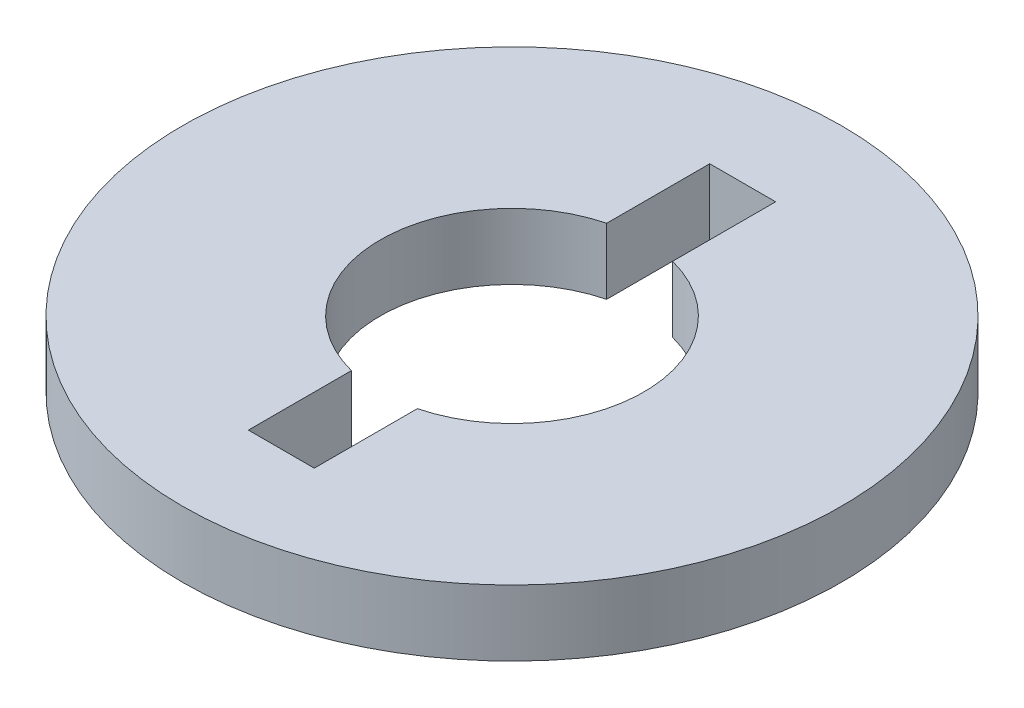
ISO-10303-21;
HEADER;
FILE_DESCRIPTION(('STEP AP214'),'2;1');
FILE_NAME('part.step','',(''),(''),'','','');
FILE_SCHEMA(('AUTOMOTIVE_DESIGN { 1 0 10303 214 1 1 1 1 }'));
ENDSEC;
DATA;
#1=APPLICATION_CONTEXT('core data for automotive mechanical design processes');
#2=APPLICATION_PROTOCOL_DEFINITION('international standard','automotive_design',2000,#1);
#3=PRODUCT_CONTEXT('',#1,'mechanical');
#4=PRODUCT('Part','Part','',(#3));
#5=PRODUCT_RELATED_PRODUCT_CATEGORY('part','',(#4));
#6=PRODUCT_DEFINITION_FORMATION('','',#4);
#7=PRODUCT_DEFINITION_CONTEXT('part definition',#1,'design');
#8=PRODUCT_DEFINITION('design','',#6,#7);
#9=PRODUCT_DEFINITION_SHAPE('','',#8);
#10=(LENGTH_UNIT() NAMED_UNIT(*) SI_UNIT(.MILLI.,.METRE.));
#11=(NAMED_UNIT(*) PLANE_ANGLE_UNIT() SI_UNIT($,.RADIAN.));
#12=(NAMED_UNIT(*) SI_UNIT($,.STERADIAN.) SOLID_ANGLE_UNIT());
#13=UNCERTAINTY_MEASURE_WITH_UNIT(LENGTH_MEASURE(1.E-05),#10,'distance_accuracy_value','');
#14=(GEOMETRIC_REPRESENTATION_CONTEXT(3) GLOBAL_UNCERTAINTY_ASSIGNED_CONTEXT((#13)) GLOBAL_UNIT_ASSIGNED_CONTEXT((#10,
#11,#12)) REPRESENTATION_CONTEXT('',''));
#15=CARTESIAN_POINT('',(0.,0.,0.));
#16=DIRECTION('',(0.,0.,1.));
#17=DIRECTION('',(1.,0.,0.));
#18=AXIS2_PLACEMENT_3D('',#15,#16,#17);
#19=CARTESIAN_POINT('',(0.,1.,0.));
#20=DIRECTION('',(0.,1.,0.));
#21=DIRECTION('',(0.,0.,1.));
#22=AXIS2_PLACEMENT_3D('',#19,#20,#21);
#23=PLANE('',#22);
#24=CARTESIAN_POINT('',(0.,1.,0.));
#25=DIRECTION('',(0.,1.,0.));
#26=DIRECTION('',(0.,0.,1.));
#27=AXIS2_PLACEMENT_3D('',#24,#25,#26);
#28=CIRCLE('',#27,5.);
#29=CARTESIAN_POINT('',(0.,1.,5.));
#30=VERTEX_POINT('',#29);
#31=EDGE_CURVE('E11',#30,#30,#28,.T.);
#32=ORIENTED_EDGE('',*,*,#31,.T.);
#33=EDGE_LOOP('',(#32));
#34=FACE_BOUND('',#33,.T.);
#35=DIRECTION('',(0.,0.,1.));
#36=VECTOR('',#35,1.);
#37=CARTESIAN_POINT('',(-0.5,1.,-1.93649167310371));
#38=LINE('',#37,#36);
#39=CARTESIAN_POINT('',(-0.5,1.,-3.5));
#40=VERTEX_POINT('',#39);
#41=CARTESIAN_POINT('',(-0.499999999999999,1.,-1.93649167310371));
#42=VERTEX_POINT('',#41);
#43=EDGE_CURVE('E114',#40,#42,#38,.T.);
#44=ORIENTED_EDGE('',*,*,#43,.F.);
#45=DIRECTION('',(-1.,0.,0.));
#46=VECTOR('',#45,1.);
#47=CARTESIAN_POINT('',(-0.5,1.,-3.5));
#48=LINE('',#47,#46);
#49=CARTESIAN_POINT('',(0.5,1.,-3.5));
#50=VERTEX_POINT('',#49);
#51=EDGE_CURVE('E106',#50,#40,#48,.T.);
#52=ORIENTED_EDGE('',*,*,#51,.F.);
#53=DIRECTION('',(0.,0.,-1.));
#54=VECTOR('',#53,1.);
#55=CARTESIAN_POINT('',(0.5,1.,-1.93649167310371));
#56=LINE('',#55,#54);
#57=CARTESIAN_POINT('',(0.5,1.,-1.93649167310371));
#58=VERTEX_POINT('',#57);
#59=EDGE_CURVE('E138',#58,#50,#56,.T.);
#60=ORIENTED_EDGE('',*,*,#59,.F.);
#61=CARTESIAN_POINT('',(0.,1.,0.));
#62=DIRECTION('',(0.,1.,0.));
#63=DIRECTION('',(0.,0.,1.));
#64=AXIS2_PLACEMENT_3D('',#61,#62,#63);
#65=CIRCLE('',#64,2.);
#66=CARTESIAN_POINT('',(0.5,1.,1.93649167310371));
#67=VERTEX_POINT('',#66);
#68=EDGE_CURVE('E136',#67,#58,#65,.T.);
#69=ORIENTED_EDGE('',*,*,#68,.F.);
#70=DIRECTION('',(0.,0.,-1.));
#71=VECTOR('',#70,1.);
#72=CARTESIAN_POINT('',(0.5,1.,3.5));
#73=LINE('',#72,#71);
#74=CARTESIAN_POINT('',(0.5,1.,3.5));
#75=VERTEX_POINT('',#74);
#76=EDGE_CURVE('E134',#75,#67,#73,.T.);
#77=ORIENTED_EDGE('',*,*,#76,.F.);
#78=DIRECTION('',(1.,0.,0.));
#79=VECTOR('',#78,1.);
#80=CARTESIAN_POINT('',(-0.5,1.,3.5));
#81=LINE('',#80,#79);
#82=CARTESIAN_POINT('',(-0.5,1.,3.5));
#83=VERTEX_POINT('',#82);
#84=EDGE_CURVE('E132',#83,#75,#81,.T.);
#85=ORIENTED_EDGE('',*,*,#84,.F.);
#86=DIRECTION('',(0.,0.,1.));
#87=VECTOR('',#86,1.);
#88=CARTESIAN_POINT('',(-0.5,1.,3.5));
#89=LINE('',#88,#87);
#90=CARTESIAN_POINT('',(-0.5,1.,1.93649167310371));
#91=VERTEX_POINT('',#90);
#92=EDGE_CURVE('E128',#91,#83,#89,.T.);
#93=ORIENTED_EDGE('',*,*,#92,.F.);
#94=CARTESIAN_POINT('',(0.,1.,0.));
#95=DIRECTION('',(0.,1.,0.));
#96=DIRECTION('',(0.,0.,1.));
#97=AXIS2_PLACEMENT_3D('',#94,#95,#96);
#98=CIRCLE('',#97,2.);
#99=EDGE_CURVE('E126',#42,#91,#98,.T.);
#100=ORIENTED_EDGE('',*,*,#99,.F.);
#101=EDGE_LOOP('',(#44,#52,#60,#69,#77,#85,#93,#100));
#102=FACE_BOUND('',#101,.T.);
#103=ADVANCED_FACE('F41',(#34,#102),#23,.T.);
#104=CARTESIAN_POINT('',(0.,0.,0.));
#105=DIRECTION('',(0.,1.,0.));
#106=DIRECTION('',(0.,0.,1.));
#107=AXIS2_PLACEMENT_3D('',#104,#105,#106);
#108=PLANE('',#107);
#109=CARTESIAN_POINT('',(0.,0.,0.));
#110=DIRECTION('',(0.,1.,0.));
#111=DIRECTION('',(0.,0.,1.));
#112=AXIS2_PLACEMENT_3D('',#109,#110,#111);
#113=CIRCLE('',#112,5.);
#114=CARTESIAN_POINT('',(0.,0.,5.));
#115=VERTEX_POINT('',#114);
#116=EDGE_CURVE('E45',#115,#115,#113,.T.);
#117=ORIENTED_EDGE('',*,*,#116,.F.);
#118=EDGE_LOOP('',(#117));
#119=FACE_BOUND('',#118,.T.);
#120=DIRECTION('',(-1.,0.,0.));
#121=VECTOR('',#120,1.);
#122=CARTESIAN_POINT('',(-0.5,0.,-3.5));
#123=LINE('',#122,#121);
#124=CARTESIAN_POINT('',(0.5,0.,-3.5));
#125=VERTEX_POINT('',#124);
#126=CARTESIAN_POINT('',(-0.5,0.,-3.5));
#127=VERTEX_POINT('',#126);
#128=EDGE_CURVE('E64',#125,#127,#123,.T.);
#129=ORIENTED_EDGE('',*,*,#128,.T.);
#130=DIRECTION('',(0.,0.,1.));
#131=VECTOR('',#130,1.);
#132=CARTESIAN_POINT('',(-0.5,0.,-1.93649167310371));
#133=LINE('',#132,#131);
#134=CARTESIAN_POINT('',(-0.499999999999999,0.,-1.93649167310371));
#135=VERTEX_POINT('',#134);
#136=EDGE_CURVE('E121',#127,#135,#133,.T.);
#137=ORIENTED_EDGE('',*,*,#136,.T.);
#138=CARTESIAN_POINT('',(0.,0.,0.));
#139=DIRECTION('',(0.,1.,0.));
#140=DIRECTION('',(0.,0.,1.));
#141=AXIS2_PLACEMENT_3D('',#138,#139,#140);
#142=CIRCLE('',#141,2.);
#143=CARTESIAN_POINT('',(-0.5,0.,1.93649167310371));
#144=VERTEX_POINT('',#143);
#145=EDGE_CURVE('E142',#135,#144,#142,.T.);
#146=ORIENTED_EDGE('',*,*,#145,.T.);
#147=DIRECTION('',(0.,0.,1.));
#148=VECTOR('',#147,1.);
#149=CARTESIAN_POINT('',(-0.5,0.,3.5));
#150=LINE('',#149,#148);
#151=CARTESIAN_POINT('',(-0.5,0.,3.5));
#152=VERTEX_POINT('',#151);
#153=EDGE_CURVE('E145',#144,#152,#150,.T.);
#154=ORIENTED_EDGE('',*,*,#153,.T.);
#155=DIRECTION('',(1.,0.,0.));
#156=VECTOR('',#155,1.);
#157=CARTESIAN_POINT('',(-0.5,0.,3.5));
#158=LINE('',#157,#156);
#159=CARTESIAN_POINT('',(0.5,0.,3.5));
#160=VERTEX_POINT('',#159);
#161=EDGE_CURVE('E148',#152,#160,#158,.T.);
#162=ORIENTED_EDGE('',*,*,#161,.T.);
#163=DIRECTION('',(0.,0.,-1.));
#164=VECTOR('',#163,1.);
#165=CARTESIAN_POINT('',(0.5,0.,3.5));
#166=LINE('',#165,#164);
#167=CARTESIAN_POINT('',(0.5,0.,1.93649167310371));
#168=VERTEX_POINT('',#167);
#169=EDGE_CURVE('E151',#160,#168,#166,.T.);
#170=ORIENTED_EDGE('',*,*,#169,.T.);
#171=CARTESIAN_POINT('',(0.,0.,0.));
#172=DIRECTION('',(0.,1.,0.));
#173=DIRECTION('',(0.,0.,1.));
#174=AXIS2_PLACEMENT_3D('',#171,#172,#173);
#175=CIRCLE('',#174,2.);
#176=CARTESIAN_POINT('',(0.5,0.,-1.93649167310371));
#177=VERTEX_POINT('',#176);
#178=EDGE_CURVE('E154',#168,#177,#175,.T.);
#179=ORIENTED_EDGE('',*,*,#178,.T.);
#180=DIRECTION('',(0.,0.,-1.));
#181=VECTOR('',#180,1.);
#182=CARTESIAN_POINT('',(0.5,0.,-1.93649167310371));
#183=LINE('',#182,#181);
#184=EDGE_CURVE('E115',#177,#125,#183,.T.);
#185=ORIENTED_EDGE('',*,*,#184,.T.);
#186=EDGE_LOOP('',(#129,#137,#146,#154,#162,#170,#179,#185));
#187=FACE_BOUND('',#186,.T.);
#188=ADVANCED_FACE('F175',(#119,#187),#108,.F.);
#189=CARTESIAN_POINT('',(0.,1.,0.));
#190=DIRECTION('',(0.,-1.,0.));
#191=DIRECTION('',(0.,0.,-1.));
#192=AXIS2_PLACEMENT_3D('',#189,#190,#191);
#193=CYLINDRICAL_SURFACE('',#192,5.);
#194=ORIENTED_EDGE('',*,*,#31,.F.);
#195=EDGE_LOOP('',(#194));
#196=FACE_BOUND('',#195,.T.);
#197=ORIENTED_EDGE('',*,*,#116,.T.);
#198=EDGE_LOOP('',(#197));
#199=FACE_BOUND('',#198,.T.);
#200=ADVANCED_FACE('F43',(#196,#199),#193,.T.);
#201=CARTESIAN_POINT('',(-0.5,1.,-3.5));
#202=DIRECTION('',(0.,0.,1.));
#203=DIRECTION('',(1.,0.,0.));
#204=AXIS2_PLACEMENT_3D('',#201,#202,#203);
#205=PLANE('',#204);
#206=ORIENTED_EDGE('',*,*,#128,.F.);
#207=DIRECTION('',(0.,-1.,0.));
#208=VECTOR('',#207,1.);
#209=CARTESIAN_POINT('',(0.5,1.,-3.5));
#210=LINE('',#209,#208);
#211=EDGE_CURVE('E110',#50,#125,#210,.T.);
#212=ORIENTED_EDGE('',*,*,#211,.F.);
#213=ORIENTED_EDGE('',*,*,#51,.T.);
#214=DIRECTION('',(0.,-1.,0.));
#215=VECTOR('',#214,1.);
#216=CARTESIAN_POINT('',(-0.5,1.,-3.5));
#217=LINE('',#216,#215);
#218=EDGE_CURVE('E109',#40,#127,#217,.T.);
#219=ORIENTED_EDGE('',*,*,#218,.T.);
#220=EDGE_LOOP('',(#206,#212,#213,#219));
#221=FACE_BOUND('',#220,.T.);
#222=ADVANCED_FACE('F108',(#221),#205,.T.);
#223=CARTESIAN_POINT('',(-0.5,1.,-1.93649167310371));
#224=DIRECTION('',(1.,0.,0.));
#225=DIRECTION('',(0.,0.,-1.));
#226=AXIS2_PLACEMENT_3D('',#223,#224,#225);
#227=PLANE('',#226);
#228=ORIENTED_EDGE('',*,*,#136,.F.);
#229=ORIENTED_EDGE('',*,*,#218,.F.);
#230=ORIENTED_EDGE('',*,*,#43,.T.);
#231=DIRECTION('',(0.,-1.,0.));
#232=VECTOR('',#231,1.);
#233=CARTESIAN_POINT('',(-0.499999999999999,1.,-1.93649167310371));
#234=LINE('',#233,#232);
#235=EDGE_CURVE('E122',#42,#135,#234,.T.);
#236=ORIENTED_EDGE('',*,*,#235,.T.);
#237=EDGE_LOOP('',(#228,#229,#230,#236));
#238=FACE_BOUND('',#237,.T.);
#239=ADVANCED_FACE('F118',(#238),#227,.T.);
#240=CARTESIAN_POINT('',(0.,1.,0.));
#241=DIRECTION('',(0.,-1.,0.));
#242=DIRECTION('',(0.,0.,-1.));
#243=AXIS2_PLACEMENT_3D('',#240,#241,#242);
#244=CYLINDRICAL_SURFACE('',#243,2.);
#245=ORIENTED_EDGE('',*,*,#145,.F.);
#246=ORIENTED_EDGE('',*,*,#235,.F.);
#247=ORIENTED_EDGE('',*,*,#99,.T.);
#248=DIRECTION('',(0.,-1.,0.));
#249=VECTOR('',#248,1.);
#250=CARTESIAN_POINT('',(-0.5,1.,1.93649167310371));
#251=LINE('',#250,#249);
#252=EDGE_CURVE('E167',#91,#144,#251,.T.);
#253=ORIENTED_EDGE('',*,*,#252,.T.);
#254=EDGE_LOOP('',(#245,#246,#247,#253));
#255=FACE_BOUND('',#254,.T.);
#256=ADVANCED_FACE('F171',(#255),#244,.F.);
#257=CARTESIAN_POINT('',(-0.5,1.,3.5));
#258=DIRECTION('',(1.,0.,0.));
#259=DIRECTION('',(0.,0.,-1.));
#260=AXIS2_PLACEMENT_3D('',#257,#258,#259);
#261=PLANE('',#260);
#262=ORIENTED_EDGE('',*,*,#153,.F.);
#263=ORIENTED_EDGE('',*,*,#252,.F.);
#264=ORIENTED_EDGE('',*,*,#92,.T.);
#265=DIRECTION('',(0.,-1.,0.));
#266=VECTOR('',#265,1.);
#267=CARTESIAN_POINT('',(-0.5,1.,3.5));
#268=LINE('',#267,#266);
#269=EDGE_CURVE('E165',#83,#152,#268,.T.);
#270=ORIENTED_EDGE('',*,*,#269,.T.);
#271=EDGE_LOOP('',(#262,#263,#264,#270));
#272=FACE_BOUND('',#271,.T.);
#273=ADVANCED_FACE('F193',(#272),#261,.T.);
#274=CARTESIAN_POINT('',(-0.5,1.,3.5));
#275=DIRECTION('',(0.,0.,-1.));
#276=DIRECTION('',(-1.,0.,0.));
#277=AXIS2_PLACEMENT_3D('',#274,#275,#276);
#278=PLANE('',#277);
#279=ORIENTED_EDGE('',*,*,#161,.F.);
#280=ORIENTED_EDGE('',*,*,#269,.F.);
#281=ORIENTED_EDGE('',*,*,#84,.T.);
#282=DIRECTION('',(0.,-1.,0.));
#283=VECTOR('',#282,1.);
#284=CARTESIAN_POINT('',(0.5,1.,3.5));
#285=LINE('',#284,#283);
#286=EDGE_CURVE('E163',#75,#160,#285,.T.);
#287=ORIENTED_EDGE('',*,*,#286,.T.);
#288=EDGE_LOOP('',(#279,#280,#281,#287));
#289=FACE_BOUND('',#288,.T.);
#290=ADVANCED_FACE('F190',(#289),#278,.T.);
#291=CARTESIAN_POINT('',(0.5,1.,3.5));
#292=DIRECTION('',(-1.,0.,0.));
#293=DIRECTION('',(0.,0.,1.));
#294=AXIS2_PLACEMENT_3D('',#291,#292,#293);
#295=PLANE('',#294);
#296=ORIENTED_EDGE('',*,*,#169,.F.);
#297=ORIENTED_EDGE('',*,*,#286,.F.);
#298=ORIENTED_EDGE('',*,*,#76,.T.);
#299=DIRECTION('',(0.,-1.,0.));
#300=VECTOR('',#299,1.);
#301=CARTESIAN_POINT('',(0.5,1.,1.93649167310371));
#302=LINE('',#301,#300);
#303=EDGE_CURVE('E161',#67,#168,#302,.T.);
#304=ORIENTED_EDGE('',*,*,#303,.T.);
#305=EDGE_LOOP('',(#296,#297,#298,#304));
#306=FACE_BOUND('',#305,.T.);
#307=ADVANCED_FACE('F186',(#306),#295,.T.);
#308=CARTESIAN_POINT('',(0.,1.,0.));
#309=DIRECTION('',(0.,-1.,0.));
#310=DIRECTION('',(0.,0.,-1.));
#311=AXIS2_PLACEMENT_3D('',#308,#309,#310);
#312=CYLINDRICAL_SURFACE('',#311,2.);
#313=ORIENTED_EDGE('',*,*,#178,.F.);
#314=ORIENTED_EDGE('',*,*,#303,.F.);
#315=ORIENTED_EDGE('',*,*,#68,.T.);
#316=DIRECTION('',(0.,-1.,0.));
#317=VECTOR('',#316,1.);
#318=CARTESIAN_POINT('',(0.5,1.,-1.93649167310371));
#319=LINE('',#318,#317);
#320=EDGE_CURVE('E56',#58,#177,#319,.T.);
#321=ORIENTED_EDGE('',*,*,#320,.T.);
#322=EDGE_LOOP('',(#313,#314,#315,#321));
#323=FACE_BOUND('',#322,.T.);
#324=ADVANCED_FACE('F183',(#323),#312,.F.);
#325=CARTESIAN_POINT('',(0.5,1.,-1.93649167310371));
#326=DIRECTION('',(-1.,0.,0.));
#327=DIRECTION('',(0.,0.,1.));
#328=AXIS2_PLACEMENT_3D('',#325,#326,#327);
#329=PLANE('',#328);
#330=ORIENTED_EDGE('',*,*,#184,.F.);
#331=ORIENTED_EDGE('',*,*,#320,.F.);
#332=ORIENTED_EDGE('',*,*,#59,.T.);
#333=ORIENTED_EDGE('',*,*,#211,.T.);
#334=EDGE_LOOP('',(#330,#331,#332,#333));
#335=FACE_BOUND('',#334,.T.);
#336=ADVANCED_FACE('F177',(#335),#329,.T.);
#337=CLOSED_SHELL('',(#103,#188,#200,#222,#239,#256,#273,#290,#307,#324,#336));
#338=MANIFOLD_SOLID_BREP('B2',#337);
#339=ADVANCED_BREP_SHAPE_REPRESENTATION('',(#18,#338),#14);
#340=SHAPE_DEFINITION_REPRESENTATION(#9,#339);
ENDSEC;
END-ISO-10303-21;
